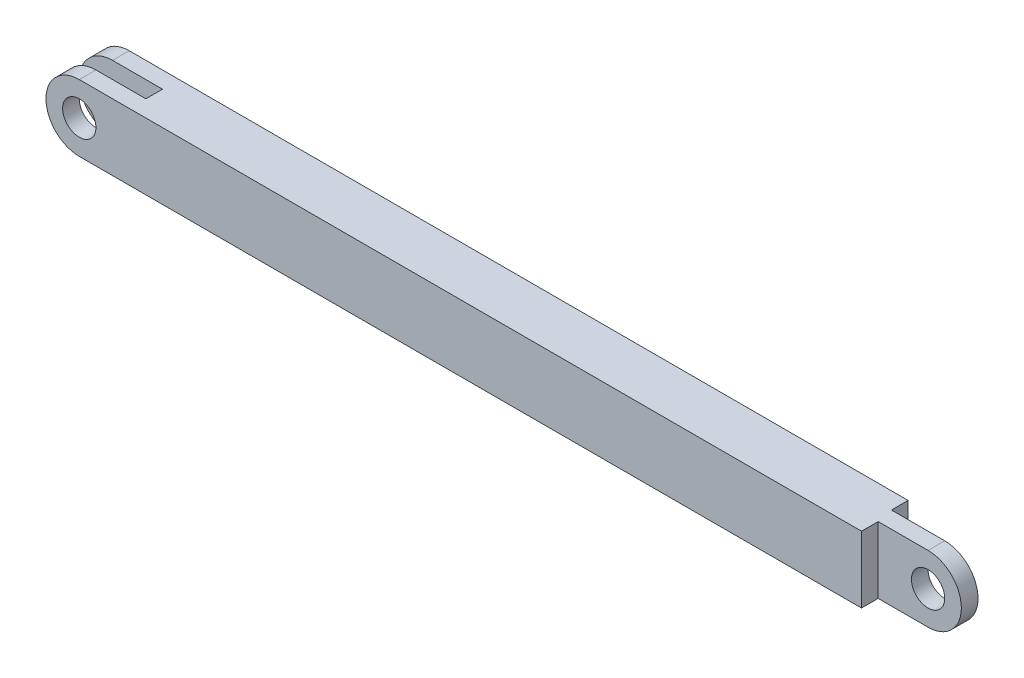
ISO-10303-21;
HEADER;
FILE_DESCRIPTION(('STEP AP214'),'2;1');
FILE_NAME('part.step','',(''),(''),'','','');
FILE_SCHEMA(('AUTOMOTIVE_DESIGN { 1 0 10303 214 1 1 1 1 }'));
ENDSEC;
DATA;
#1=APPLICATION_CONTEXT('core data for automotive mechanical design processes');
#2=APPLICATION_PROTOCOL_DEFINITION('international standard','automotive_design',2000,#1);
#3=PRODUCT_CONTEXT('',#1,'mechanical');
#4=PRODUCT('Part','Part','',(#3));
#5=PRODUCT_RELATED_PRODUCT_CATEGORY('part','',(#4));
#6=PRODUCT_DEFINITION_FORMATION('','',#4);
#7=PRODUCT_DEFINITION_CONTEXT('part definition',#1,'design');
#8=PRODUCT_DEFINITION('design','',#6,#7);
#9=PRODUCT_DEFINITION_SHAPE('','',#8);
#10=(LENGTH_UNIT() NAMED_UNIT(*) SI_UNIT(.MILLI.,.METRE.));
#11=(NAMED_UNIT(*) PLANE_ANGLE_UNIT() SI_UNIT($,.RADIAN.));
#12=(NAMED_UNIT(*) SI_UNIT($,.STERADIAN.) SOLID_ANGLE_UNIT());
#13=UNCERTAINTY_MEASURE_WITH_UNIT(LENGTH_MEASURE(1.E-05),#10,'distance_accuracy_value','');
#14=(GEOMETRIC_REPRESENTATION_CONTEXT(3) GLOBAL_UNCERTAINTY_ASSIGNED_CONTEXT((#13)) GLOBAL_UNIT_ASSIGNED_CONTEXT((#10,
#11,#12)) REPRESENTATION_CONTEXT('',''));
#15=CARTESIAN_POINT('',(0.,0.,0.));
#16=DIRECTION('',(0.,0.,1.));
#17=DIRECTION('',(1.,0.,0.));
#18=AXIS2_PLACEMENT_3D('',#15,#16,#17);
#19=CARTESIAN_POINT('',(0.,0.,30.));
#20=DIRECTION('',(0.,0.,-1.));
#21=DIRECTION('',(-1.,0.,0.));
#22=AXIS2_PLACEMENT_3D('',#19,#20,#21);
#23=CYLINDRICAL_SURFACE('',#22,20.);
#24=DIRECTION('',(0.,0.,-1.));
#25=VECTOR('',#24,1.);
#26=CARTESIAN_POINT('',(0.,-20.,30.));
#27=LINE('',#26,#25);
#28=CARTESIAN_POINT('',(0.,-20.,10.));
#29=VERTEX_POINT('',#28);
#30=CARTESIAN_POINT('',(0.,-20.,0.));
#31=VERTEX_POINT('',#30);
#32=EDGE_CURVE('E220',#29,#31,#27,.T.);
#33=ORIENTED_EDGE('',*,*,#32,.F.);
#34=CARTESIAN_POINT('',(0.,0.,10.));
#35=DIRECTION('',(0.,0.,-1.));
#36=DIRECTION('',(-1.,0.,0.));
#37=AXIS2_PLACEMENT_3D('',#34,#35,#36);
#38=CIRCLE('',#37,20.);
#39=CARTESIAN_POINT('',(0.,20.,10.));
#40=VERTEX_POINT('',#39);
#41=EDGE_CURVE('E189',#29,#40,#38,.T.);
#42=ORIENTED_EDGE('',*,*,#41,.T.);
#43=DIRECTION('',(0.,0.,-1.));
#44=VECTOR('',#43,1.);
#45=CARTESIAN_POINT('',(0.,20.,30.));
#46=LINE('',#45,#44);
#47=CARTESIAN_POINT('',(0.,20.,0.));
#48=VERTEX_POINT('',#47);
#49=EDGE_CURVE('E207',#40,#48,#46,.T.);
#50=ORIENTED_EDGE('',*,*,#49,.T.);
#51=CARTESIAN_POINT('',(0.,0.,0.));
#52=DIRECTION('',(0.,0.,1.));
#53=DIRECTION('',(1.,0.,0.));
#54=AXIS2_PLACEMENT_3D('',#51,#52,#53);
#55=CIRCLE('',#54,20.);
#56=EDGE_CURVE('E196',#48,#31,#55,.T.);
#57=ORIENTED_EDGE('',*,*,#56,.T.);
#58=EDGE_LOOP('',(#33,#42,#50,#57));
#59=FACE_BOUND('',#58,.T.);
#60=ADVANCED_FACE('F34',(#59),#23,.T.);
#61=CARTESIAN_POINT('',(0.,0.,30.));
#62=DIRECTION('',(0.,0.,-1.));
#63=DIRECTION('',(-1.,0.,0.));
#64=AXIS2_PLACEMENT_3D('',#61,#62,#63);
#65=CYLINDRICAL_SURFACE('',#64,10.);
#66=CARTESIAN_POINT('',(0.,0.,10.));
#67=DIRECTION('',(0.,0.,-1.));
#68=DIRECTION('',(-1.,0.,0.));
#69=AXIS2_PLACEMENT_3D('',#66,#67,#68);
#70=CIRCLE('',#69,10.);
#71=CARTESIAN_POINT('',(-10.,0.,10.));
#72=VERTEX_POINT('',#71);
#73=EDGE_CURVE('E188',#72,#72,#70,.T.);
#74=ORIENTED_EDGE('',*,*,#73,.F.);
#75=EDGE_LOOP('',(#74));
#76=FACE_BOUND('',#75,.T.);
#77=CARTESIAN_POINT('',(0.,0.,0.));
#78=DIRECTION('',(0.,0.,1.));
#79=DIRECTION('',(1.,0.,0.));
#80=AXIS2_PLACEMENT_3D('',#77,#78,#79);
#81=CIRCLE('',#80,10.);
#82=CARTESIAN_POINT('',(10.,0.,0.));
#83=VERTEX_POINT('',#82);
#84=EDGE_CURVE('E192',#83,#83,#81,.T.);
#85=ORIENTED_EDGE('',*,*,#84,.F.);
#86=EDGE_LOOP('',(#85));
#87=FACE_BOUND('',#86,.T.);
#88=ADVANCED_FACE('F254',(#76,#87),#65,.F.);
#89=CARTESIAN_POINT('',(0.,0.,30.));
#90=DIRECTION('',(0.,0.,1.));
#91=DIRECTION('',(1.,0.,0.));
#92=AXIS2_PLACEMENT_3D('',#89,#90,#91);
#93=PLANE('',#92);
#94=DIRECTION('',(0.,-1.,0.));
#95=VECTOR('',#94,1.);
#96=CARTESIAN_POINT('',(470.,0.,30.));
#97=LINE('',#96,#95);
#98=CARTESIAN_POINT('',(470.,20.,30.));
#99=VERTEX_POINT('',#98);
#100=CARTESIAN_POINT('',(470.,-20.,30.));
#101=VERTEX_POINT('',#100);
#102=EDGE_CURVE('E128',#99,#101,#97,.T.);
#103=ORIENTED_EDGE('',*,*,#102,.F.);
#104=DIRECTION('',(-1.,0.,0.));
#105=VECTOR('',#104,1.);
#106=CARTESIAN_POINT('',(0.,20.,30.));
#107=LINE('',#106,#105);
#108=CARTESIAN_POINT('',(0.,20.,30.));
#109=VERTEX_POINT('',#108);
#110=EDGE_CURVE('E205',#99,#109,#107,.T.);
#111=ORIENTED_EDGE('',*,*,#110,.T.);
#112=CARTESIAN_POINT('',(0.,0.,30.));
#113=DIRECTION('',(0.,0.,1.));
#114=DIRECTION('',(1.,0.,0.));
#115=AXIS2_PLACEMENT_3D('',#112,#113,#114);
#116=CIRCLE('',#115,20.);
#117=CARTESIAN_POINT('',(0.,-20.,30.));
#118=VERTEX_POINT('',#117);
#119=EDGE_CURVE('E199',#109,#118,#116,.T.);
#120=ORIENTED_EDGE('',*,*,#119,.T.);
#121=DIRECTION('',(1.,0.,0.));
#122=VECTOR('',#121,1.);
#123=CARTESIAN_POINT('',(0.,-20.,30.));
#124=LINE('',#123,#122);
#125=EDGE_CURVE('E202',#118,#101,#124,.T.);
#126=ORIENTED_EDGE('',*,*,#125,.T.);
#127=EDGE_LOOP('',(#103,#111,#120,#126));
#128=FACE_BOUND('',#127,.T.);
#129=CARTESIAN_POINT('',(0.,0.,30.));
#130=DIRECTION('',(0.,0.,1.));
#131=DIRECTION('',(1.,0.,0.));
#132=AXIS2_PLACEMENT_3D('',#129,#130,#131);
#133=CIRCLE('',#132,10.);
#134=CARTESIAN_POINT('',(10.,0.,30.));
#135=VERTEX_POINT('',#134);
#136=EDGE_CURVE('E193',#135,#135,#133,.T.);
#137=ORIENTED_EDGE('',*,*,#136,.F.);
#138=EDGE_LOOP('',(#137));
#139=FACE_BOUND('',#138,.T.);
#140=ADVANCED_FACE('F259',(#128,#139),#93,.T.);
#141=CARTESIAN_POINT('',(0.,0.,0.));
#142=DIRECTION('',(0.,0.,1.));
#143=DIRECTION('',(1.,0.,0.));
#144=AXIS2_PLACEMENT_3D('',#141,#142,#143);
#145=PLANE('',#144);
#146=ORIENTED_EDGE('',*,*,#84,.T.);
#147=EDGE_LOOP('',(#146));
#148=FACE_BOUND('',#147,.T.);
#149=DIRECTION('',(-1.,0.,0.));
#150=VECTOR('',#149,1.);
#151=CARTESIAN_POINT('',(0.,20.,0.));
#152=LINE('',#151,#150);
#153=CARTESIAN_POINT('',(467.99084266423,20.,0.));
#154=VERTEX_POINT('',#153);
#155=EDGE_CURVE('E203',#154,#48,#152,.T.);
#156=ORIENTED_EDGE('',*,*,#155,.F.);
#157=DIRECTION('',(0.,-1.,0.));
#158=VECTOR('',#157,1.);
#159=CARTESIAN_POINT('',(467.99084266423,0.,0.));
#160=LINE('',#159,#158);
#161=CARTESIAN_POINT('',(467.99084266423,-20.,0.));
#162=VERTEX_POINT('',#161);
#163=EDGE_CURVE('E160',#154,#162,#160,.T.);
#164=ORIENTED_EDGE('',*,*,#163,.T.);
#165=DIRECTION('',(1.,0.,0.));
#166=VECTOR('',#165,1.);
#167=CARTESIAN_POINT('',(0.,-20.,0.));
#168=LINE('',#167,#166);
#169=EDGE_CURVE('E210',#31,#162,#168,.T.);
#170=ORIENTED_EDGE('',*,*,#169,.F.);
#171=ORIENTED_EDGE('',*,*,#56,.F.);
#172=EDGE_LOOP('',(#156,#164,#170,#171));
#173=FACE_BOUND('',#172,.T.);
#174=ADVANCED_FACE('F265',(#148,#173),#145,.F.);
#175=CARTESIAN_POINT('',(0.,20.,20.));
#176=VERTEX_POINT('',#175);
#177=EDGE_CURVE('E213',#109,#176,#46,.T.);
#178=ORIENTED_EDGE('',*,*,#177,.T.);
#179=CARTESIAN_POINT('',(0.,0.,20.));
#180=DIRECTION('',(0.,0.,1.));
#181=DIRECTION('',(1.,0.,0.));
#182=AXIS2_PLACEMENT_3D('',#179,#180,#181);
#183=CIRCLE('',#182,20.);
#184=CARTESIAN_POINT('',(0.,-20.,20.));
#185=VERTEX_POINT('',#184);
#186=EDGE_CURVE('E185',#176,#185,#183,.T.);
#187=ORIENTED_EDGE('',*,*,#186,.T.);
#188=EDGE_CURVE('E42',#118,#185,#27,.T.);
#189=ORIENTED_EDGE('',*,*,#188,.F.);
#190=ORIENTED_EDGE('',*,*,#119,.F.);
#191=EDGE_LOOP('',(#178,#187,#189,#190));
#192=FACE_BOUND('',#191,.T.);
#193=ADVANCED_FACE('F36',(#192),#23,.T.);
#194=CARTESIAN_POINT('',(0.,-20.,30.));
#195=DIRECTION('',(0.,1.,0.));
#196=DIRECTION('',(0.,0.,1.));
#197=AXIS2_PLACEMENT_3D('',#194,#195,#196);
#198=PLANE('',#197);
#199=ORIENTED_EDGE('',*,*,#169,.T.);
#200=DIRECTION('',(0.,0.,-1.));
#201=VECTOR('',#200,1.);
#202=CARTESIAN_POINT('',(467.99084266423,-20.,9.99999999999999));
#203=LINE('',#202,#201);
#204=CARTESIAN_POINT('',(467.99084266423,-20.,9.99999999999999));
#205=VERTEX_POINT('',#204);
#206=EDGE_CURVE('E146',#205,#162,#203,.T.);
#207=ORIENTED_EDGE('',*,*,#206,.F.);
#208=DIRECTION('',(-1.,0.,0.));
#209=VECTOR('',#208,1.);
#210=CARTESIAN_POINT('',(535.290811533849,-20.,10.));
#211=LINE('',#210,#209);
#212=CARTESIAN_POINT('',(500.,-20.,10.));
#213=VERTEX_POINT('',#212);
#214=EDGE_CURVE('E144',#213,#205,#211,.T.);
#215=ORIENTED_EDGE('',*,*,#214,.F.);
#216=DIRECTION('',(0.,0.,-1.));
#217=VECTOR('',#216,1.);
#218=CARTESIAN_POINT('',(500.,-20.,30.));
#219=LINE('',#218,#217);
#220=CARTESIAN_POINT('',(500.,-20.,20.));
#221=VERTEX_POINT('',#220);
#222=EDGE_CURVE('E143',#221,#213,#219,.T.);
#223=ORIENTED_EDGE('',*,*,#222,.F.);
#224=DIRECTION('',(1.,0.,0.));
#225=VECTOR('',#224,1.);
#226=CARTESIAN_POINT('',(470.,-20.,20.));
#227=LINE('',#226,#225);
#228=CARTESIAN_POINT('',(470.,-20.,20.));
#229=VERTEX_POINT('',#228);
#230=EDGE_CURVE('E132',#229,#221,#227,.T.);
#231=ORIENTED_EDGE('',*,*,#230,.F.);
#232=DIRECTION('',(0.,0.,-1.));
#233=VECTOR('',#232,1.);
#234=CARTESIAN_POINT('',(470.,-20.,47.1629961135029));
#235=LINE('',#234,#233);
#236=EDGE_CURVE('E124',#101,#229,#235,.T.);
#237=ORIENTED_EDGE('',*,*,#236,.F.);
#238=ORIENTED_EDGE('',*,*,#125,.F.);
#239=ORIENTED_EDGE('',*,*,#188,.T.);
#240=DIRECTION('',(-1.,0.,0.));
#241=VECTOR('',#240,1.);
#242=CARTESIAN_POINT('',(30.,-20.,20.));
#243=LINE('',#242,#241);
#244=CARTESIAN_POINT('',(30.,-20.,20.));
#245=VERTEX_POINT('',#244);
#246=EDGE_CURVE('E177',#245,#185,#243,.T.);
#247=ORIENTED_EDGE('',*,*,#246,.F.);
#248=DIRECTION('',(0.,0.,1.));
#249=VECTOR('',#248,1.);
#250=CARTESIAN_POINT('',(30.,-20.,20.));
#251=LINE('',#250,#249);
#252=CARTESIAN_POINT('',(30.,-20.,10.));
#253=VERTEX_POINT('',#252);
#254=EDGE_CURVE('E163',#253,#245,#251,.T.);
#255=ORIENTED_EDGE('',*,*,#254,.F.);
#256=DIRECTION('',(1.,0.,0.));
#257=VECTOR('',#256,1.);
#258=CARTESIAN_POINT('',(30.,-20.,10.));
#259=LINE('',#258,#257);
#260=EDGE_CURVE('E168',#29,#253,#259,.T.);
#261=ORIENTED_EDGE('',*,*,#260,.F.);
#262=ORIENTED_EDGE('',*,*,#32,.T.);
#263=EDGE_LOOP('',(#199,#207,#215,#223,#231,#237,#238,#239,#247,#255,#261,#262));
#264=FACE_BOUND('',#263,.T.);
#265=ADVANCED_FACE('F140',(#264),#198,.F.);
#266=CARTESIAN_POINT('',(500.,0.,30.));
#267=DIRECTION('',(0.,0.,-1.));
#268=DIRECTION('',(-1.,0.,0.));
#269=AXIS2_PLACEMENT_3D('',#266,#267,#268);
#270=CYLINDRICAL_SURFACE('',#269,20.);
#271=ORIENTED_EDGE('',*,*,#222,.T.);
#272=CARTESIAN_POINT('',(500.,0.,10.));
#273=DIRECTION('',(0.,0.,1.));
#274=DIRECTION('',(1.,0.,0.));
#275=AXIS2_PLACEMENT_3D('',#272,#273,#274);
#276=CIRCLE('',#275,20.);
#277=CARTESIAN_POINT('',(500.,20.,10.));
#278=VERTEX_POINT('',#277);
#279=EDGE_CURVE('E156',#213,#278,#276,.T.);
#280=ORIENTED_EDGE('',*,*,#279,.T.);
#281=DIRECTION('',(0.,0.,-1.));
#282=VECTOR('',#281,1.);
#283=CARTESIAN_POINT('',(500.,20.,30.));
#284=LINE('',#283,#282);
#285=CARTESIAN_POINT('',(500.,20.,20.));
#286=VERTEX_POINT('',#285);
#287=EDGE_CURVE('E216',#286,#278,#284,.T.);
#288=ORIENTED_EDGE('',*,*,#287,.F.);
#289=CARTESIAN_POINT('',(500.,0.,20.));
#290=DIRECTION('',(0.,0.,-1.));
#291=DIRECTION('',(-1.,0.,0.));
#292=AXIS2_PLACEMENT_3D('',#289,#290,#291);
#293=CIRCLE('',#292,20.);
#294=EDGE_CURVE('E153',#286,#221,#293,.T.);
#295=ORIENTED_EDGE('',*,*,#294,.T.);
#296=EDGE_LOOP('',(#271,#280,#288,#295));
#297=FACE_BOUND('',#296,.T.);
#298=ADVANCED_FACE('F271',(#297),#270,.T.);
#299=CARTESIAN_POINT('',(0.,20.,30.));
#300=DIRECTION('',(0.,-1.,0.));
#301=DIRECTION('',(0.,0.,-1.));
#302=AXIS2_PLACEMENT_3D('',#299,#300,#301);
#303=PLANE('',#302);
#304=DIRECTION('',(-1.,0.,0.));
#305=VECTOR('',#304,1.);
#306=CARTESIAN_POINT('',(535.290811533849,20.,10.));
#307=LINE('',#306,#305);
#308=CARTESIAN_POINT('',(467.99084266423,20.,9.99999999999999));
#309=VERTEX_POINT('',#308);
#310=EDGE_CURVE('E310',#278,#309,#307,.T.);
#311=ORIENTED_EDGE('',*,*,#310,.T.);
#312=DIRECTION('',(0.,0.,-1.));
#313=VECTOR('',#312,1.);
#314=CARTESIAN_POINT('',(467.99084266423,20.,9.99999999999999));
#315=LINE('',#314,#313);
#316=EDGE_CURVE('E49',#309,#154,#315,.T.);
#317=ORIENTED_EDGE('',*,*,#316,.T.);
#318=ORIENTED_EDGE('',*,*,#155,.T.);
#319=ORIENTED_EDGE('',*,*,#49,.F.);
#320=DIRECTION('',(1.,0.,0.));
#321=VECTOR('',#320,1.);
#322=CARTESIAN_POINT('',(30.,20.,10.));
#323=LINE('',#322,#321);
#324=CARTESIAN_POINT('',(30.,20.,10.));
#325=VERTEX_POINT('',#324);
#326=EDGE_CURVE('E171',#40,#325,#323,.T.);
#327=ORIENTED_EDGE('',*,*,#326,.T.);
#328=DIRECTION('',(0.,0.,1.));
#329=VECTOR('',#328,1.);
#330=CARTESIAN_POINT('',(30.,20.,20.));
#331=LINE('',#330,#329);
#332=CARTESIAN_POINT('',(30.,20.,20.));
#333=VERTEX_POINT('',#332);
#334=EDGE_CURVE('E164',#325,#333,#331,.T.);
#335=ORIENTED_EDGE('',*,*,#334,.T.);
#336=DIRECTION('',(-1.,0.,0.));
#337=VECTOR('',#336,1.);
#338=CARTESIAN_POINT('',(30.,20.,20.));
#339=LINE('',#338,#337);
#340=EDGE_CURVE('E167',#333,#176,#339,.T.);
#341=ORIENTED_EDGE('',*,*,#340,.T.);
#342=ORIENTED_EDGE('',*,*,#177,.F.);
#343=ORIENTED_EDGE('',*,*,#110,.F.);
#344=DIRECTION('',(0.,0.,-1.));
#345=VECTOR('',#344,1.);
#346=CARTESIAN_POINT('',(470.,20.,30.));
#347=LINE('',#346,#345);
#348=CARTESIAN_POINT('',(470.,20.,20.));
#349=VERTEX_POINT('',#348);
#350=EDGE_CURVE('E11',#99,#349,#347,.T.);
#351=ORIENTED_EDGE('',*,*,#350,.T.);
#352=DIRECTION('',(1.,0.,0.));
#353=VECTOR('',#352,1.);
#354=CARTESIAN_POINT('',(470.,20.,20.));
#355=LINE('',#354,#353);
#356=EDGE_CURVE('E57',#349,#286,#355,.T.);
#357=ORIENTED_EDGE('',*,*,#356,.T.);
#358=ORIENTED_EDGE('',*,*,#287,.T.);
#359=EDGE_LOOP('',(#311,#317,#318,#319,#327,#335,#341,#342,#343,#351,#357,#358));
#360=FACE_BOUND('',#359,.T.);
#361=ADVANCED_FACE('F280',(#360),#303,.F.);
#362=CARTESIAN_POINT('',(0.,0.,20.));
#363=DIRECTION('',(0.,0.,1.));
#364=DIRECTION('',(1.,0.,0.));
#365=AXIS2_PLACEMENT_3D('',#362,#363,#364);
#366=CIRCLE('',#365,10.);
#367=CARTESIAN_POINT('',(10.,0.,20.));
#368=VERTEX_POINT('',#367);
#369=EDGE_CURVE('E183',#368,#368,#366,.T.);
#370=ORIENTED_EDGE('',*,*,#369,.F.);
#371=EDGE_LOOP('',(#370));
#372=FACE_BOUND('',#371,.T.);
#373=ORIENTED_EDGE('',*,*,#136,.T.);
#374=EDGE_LOOP('',(#373));
#375=FACE_BOUND('',#374,.T.);
#376=ADVANCED_FACE('F262',(#372,#375),#65,.F.);
#377=CARTESIAN_POINT('',(30.,20.,10.));
#378=DIRECTION('',(0.,0.,-1.));
#379=DIRECTION('',(-1.,0.,0.));
#380=AXIS2_PLACEMENT_3D('',#377,#378,#379);
#381=PLANE('',#380);
#382=ORIENTED_EDGE('',*,*,#73,.T.);
#383=EDGE_LOOP('',(#382));
#384=FACE_BOUND('',#383,.T.);
#385=ORIENTED_EDGE('',*,*,#260,.T.);
#386=DIRECTION('',(0.,-1.,0.));
#387=VECTOR('',#386,1.);
#388=CARTESIAN_POINT('',(30.,20.,10.));
#389=LINE('',#388,#387);
#390=EDGE_CURVE('E180',#325,#253,#389,.T.);
#391=ORIENTED_EDGE('',*,*,#390,.F.);
#392=ORIENTED_EDGE('',*,*,#326,.F.);
#393=ORIENTED_EDGE('',*,*,#41,.F.);
#394=EDGE_LOOP('',(#385,#391,#392,#393));
#395=FACE_BOUND('',#394,.T.);
#396=ADVANCED_FACE('F294',(#384,#395),#381,.F.);
#397=CARTESIAN_POINT('',(30.,20.,20.));
#398=DIRECTION('',(0.,0.,1.));
#399=DIRECTION('',(1.,0.,0.));
#400=AXIS2_PLACEMENT_3D('',#397,#398,#399);
#401=PLANE('',#400);
#402=ORIENTED_EDGE('',*,*,#369,.T.);
#403=EDGE_LOOP('',(#402));
#404=FACE_BOUND('',#403,.T.);
#405=ORIENTED_EDGE('',*,*,#340,.F.);
#406=DIRECTION('',(0.,-1.,0.));
#407=VECTOR('',#406,1.);
#408=CARTESIAN_POINT('',(30.,20.,20.));
#409=LINE('',#408,#407);
#410=EDGE_CURVE('E174',#333,#245,#409,.T.);
#411=ORIENTED_EDGE('',*,*,#410,.T.);
#412=ORIENTED_EDGE('',*,*,#246,.T.);
#413=ORIENTED_EDGE('',*,*,#186,.F.);
#414=EDGE_LOOP('',(#405,#411,#412,#413));
#415=FACE_BOUND('',#414,.T.);
#416=ADVANCED_FACE('F249',(#404,#415),#401,.F.);
#417=CARTESIAN_POINT('',(30.,20.,20.));
#418=DIRECTION('',(1.,0.,0.));
#419=DIRECTION('',(0.,0.,-1.));
#420=AXIS2_PLACEMENT_3D('',#417,#418,#419);
#421=PLANE('',#420);
#422=ORIENTED_EDGE('',*,*,#254,.T.);
#423=ORIENTED_EDGE('',*,*,#410,.F.);
#424=ORIENTED_EDGE('',*,*,#334,.F.);
#425=ORIENTED_EDGE('',*,*,#390,.T.);
#426=EDGE_LOOP('',(#422,#423,#424,#425));
#427=FACE_BOUND('',#426,.T.);
#428=ADVANCED_FACE('F241',(#427),#421,.F.);
#429=CARTESIAN_POINT('',(470.,20.,20.));
#430=DIRECTION('',(0.,0.,-1.));
#431=DIRECTION('',(-1.,0.,0.));
#432=AXIS2_PLACEMENT_3D('',#429,#430,#431);
#433=PLANE('',#432);
#434=CARTESIAN_POINT('',(500.,0.,20.));
#435=DIRECTION('',(0.,0.,-1.));
#436=DIRECTION('',(-1.,0.,0.));
#437=AXIS2_PLACEMENT_3D('',#434,#435,#436);
#438=CIRCLE('',#437,9.99999999999998);
#439=CARTESIAN_POINT('',(490.,0.,20.));
#440=VERTEX_POINT('',#439);
#441=EDGE_CURVE('E151',#440,#440,#438,.T.);
#442=ORIENTED_EDGE('',*,*,#441,.T.);
#443=EDGE_LOOP('',(#442));
#444=FACE_BOUND('',#443,.T.);
#445=ORIENTED_EDGE('',*,*,#356,.F.);
#446=DIRECTION('',(0.,-1.,0.));
#447=VECTOR('',#446,1.);
#448=CARTESIAN_POINT('',(470.,20.,20.));
#449=LINE('',#448,#447);
#450=EDGE_CURVE('E126',#349,#229,#449,.T.);
#451=ORIENTED_EDGE('',*,*,#450,.T.);
#452=ORIENTED_EDGE('',*,*,#230,.T.);
#453=ORIENTED_EDGE('',*,*,#294,.F.);
#454=EDGE_LOOP('',(#445,#451,#452,#453));
#455=FACE_BOUND('',#454,.T.);
#456=ADVANCED_FACE('F134',(#444,#455),#433,.F.);
#457=CARTESIAN_POINT('',(470.,20.,47.1629961135029));
#458=DIRECTION('',(-1.,0.,0.));
#459=DIRECTION('',(0.,0.,1.));
#460=AXIS2_PLACEMENT_3D('',#457,#458,#459);
#461=PLANE('',#460);
#462=ORIENTED_EDGE('',*,*,#102,.T.);
#463=ORIENTED_EDGE('',*,*,#236,.T.);
#464=ORIENTED_EDGE('',*,*,#450,.F.);
#465=ORIENTED_EDGE('',*,*,#350,.F.);
#466=EDGE_LOOP('',(#462,#463,#464,#465));
#467=FACE_BOUND('',#466,.T.);
#468=ADVANCED_FACE('F125',(#467),#461,.F.);
#469=CARTESIAN_POINT('',(467.99084266423,20.,9.99999999999999));
#470=DIRECTION('',(-1.,0.,0.));
#471=DIRECTION('',(0.,0.,1.));
#472=AXIS2_PLACEMENT_3D('',#469,#470,#471);
#473=PLANE('',#472);
#474=ORIENTED_EDGE('',*,*,#316,.F.);
#475=DIRECTION('',(0.,-1.,0.));
#476=VECTOR('',#475,1.);
#477=CARTESIAN_POINT('',(467.99084266423,20.,9.99999999999999));
#478=LINE('',#477,#476);
#479=EDGE_CURVE('E136',#309,#205,#478,.T.);
#480=ORIENTED_EDGE('',*,*,#479,.T.);
#481=ORIENTED_EDGE('',*,*,#206,.T.);
#482=ORIENTED_EDGE('',*,*,#163,.F.);
#483=EDGE_LOOP('',(#474,#480,#481,#482));
#484=FACE_BOUND('',#483,.T.);
#485=ADVANCED_FACE('F247',(#484),#473,.F.);
#486=CARTESIAN_POINT('',(535.290811533849,20.,10.));
#487=DIRECTION('',(0.,0.,1.));
#488=DIRECTION('',(1.,0.,0.));
#489=AXIS2_PLACEMENT_3D('',#486,#487,#488);
#490=PLANE('',#489);
#491=CARTESIAN_POINT('',(500.,0.,10.));
#492=DIRECTION('',(0.,0.,1.));
#493=DIRECTION('',(1.,0.,0.));
#494=AXIS2_PLACEMENT_3D('',#491,#492,#493);
#495=CIRCLE('',#494,9.99999999999998);
#496=CARTESIAN_POINT('',(510.,0.,10.));
#497=VERTEX_POINT('',#496);
#498=EDGE_CURVE('E155',#497,#497,#495,.T.);
#499=ORIENTED_EDGE('',*,*,#498,.T.);
#500=EDGE_LOOP('',(#499));
#501=FACE_BOUND('',#500,.T.);
#502=ORIENTED_EDGE('',*,*,#214,.T.);
#503=ORIENTED_EDGE('',*,*,#479,.F.);
#504=ORIENTED_EDGE('',*,*,#310,.F.);
#505=ORIENTED_EDGE('',*,*,#279,.F.);
#506=EDGE_LOOP('',(#502,#503,#504,#505));
#507=FACE_BOUND('',#506,.T.);
#508=ADVANCED_FACE('F231',(#501,#507),#490,.F.);
#509=CARTESIAN_POINT('',(500.,0.,30.));
#510=DIRECTION('',(0.,0.,-1.));
#511=DIRECTION('',(-1.,0.,0.));
#512=AXIS2_PLACEMENT_3D('',#509,#510,#511);
#513=CYLINDRICAL_SURFACE('',#512,9.99999999999998);
#514=ORIENTED_EDGE('',*,*,#498,.F.);
#515=EDGE_LOOP('',(#514));
#516=FACE_BOUND('',#515,.T.);
#517=ORIENTED_EDGE('',*,*,#441,.F.);
#518=EDGE_LOOP('',(#517));
#519=FACE_BOUND('',#518,.T.);
#520=ADVANCED_FACE('F234',(#516,#519),#513,.F.);
#521=CLOSED_SHELL('',(#60,#88,#140,#174,#193,#265,#298,#361,#376,#396,#416,#428,#456,#468,#485,
#508,#520));
#522=MANIFOLD_SOLID_BREP('B2',#521);
#523=ADVANCED_BREP_SHAPE_REPRESENTATION('',(#18,#522),#14);
#524=SHAPE_DEFINITION_REPRESENTATION(#9,#523);
ENDSEC;
END-ISO-10303-21;
